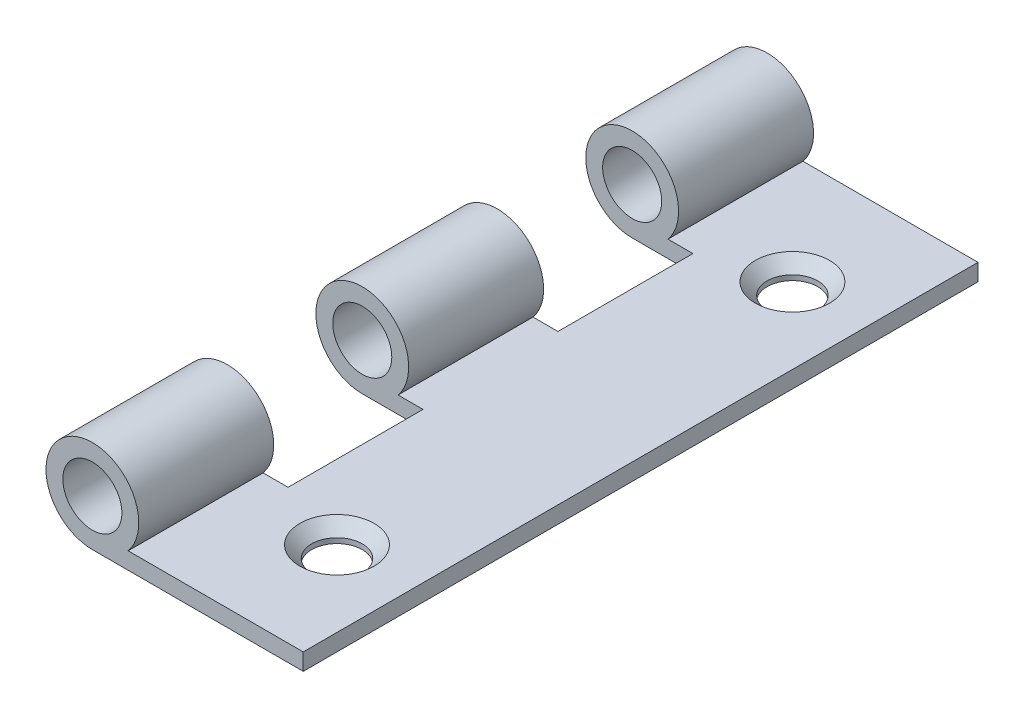
ISO-10303-21;
HEADER;
FILE_DESCRIPTION(('STEP AP214'),'2;1');
FILE_NAME('part.step','',(''),(''),'','','');
FILE_SCHEMA(('AUTOMOTIVE_DESIGN { 1 0 10303 214 1 1 1 1 }'));
ENDSEC;
DATA;
#1=APPLICATION_CONTEXT('core data for automotive mechanical design processes');
#2=APPLICATION_PROTOCOL_DEFINITION('international standard','automotive_design',2000,#1);
#3=PRODUCT_CONTEXT('',#1,'mechanical');
#4=PRODUCT('Part','Part','',(#3));
#5=PRODUCT_RELATED_PRODUCT_CATEGORY('part','',(#4));
#6=PRODUCT_DEFINITION_FORMATION('','',#4);
#7=PRODUCT_DEFINITION_CONTEXT('part definition',#1,'design');
#8=PRODUCT_DEFINITION('design','',#6,#7);
#9=PRODUCT_DEFINITION_SHAPE('','',#8);
#10=(LENGTH_UNIT() NAMED_UNIT(*) SI_UNIT(.MILLI.,.METRE.));
#11=(NAMED_UNIT(*) PLANE_ANGLE_UNIT() SI_UNIT($,.RADIAN.));
#12=(NAMED_UNIT(*) SI_UNIT($,.STERADIAN.) SOLID_ANGLE_UNIT());
#13=UNCERTAINTY_MEASURE_WITH_UNIT(LENGTH_MEASURE(1.E-05),#10,'distance_accuracy_value','');
#14=(GEOMETRIC_REPRESENTATION_CONTEXT(3) GLOBAL_UNCERTAINTY_ASSIGNED_CONTEXT((#13)) GLOBAL_UNIT_ASSIGNED_CONTEXT((#10,
#11,#12)) REPRESENTATION_CONTEXT('',''));
#15=CARTESIAN_POINT('',(0.,0.,0.));
#16=DIRECTION('',(0.,0.,1.));
#17=DIRECTION('',(1.,0.,0.));
#18=AXIS2_PLACEMENT_3D('',#15,#16,#17);
#19=CARTESIAN_POINT('',(12.5,-1.75,40.));
#20=DIRECTION('',(0.,-1.,0.));
#21=DIRECTION('',(1.,0.,0.));
#22=AXIS2_PLACEMENT_3D('',#19,#20,#21);
#23=PLANE('',#22);
#24=CARTESIAN_POINT('',(8.,-1.75,33.5));
#25=DIRECTION('',(0.,1.,0.));
#26=DIRECTION('',(0.,0.,1.));
#27=AXIS2_PLACEMENT_3D('',#24,#25,#26);
#28=CIRCLE('',#27,2.2);
#29=CARTESIAN_POINT('',(8.,-1.75,35.7));
#30=VERTEX_POINT('',#29);
#31=EDGE_CURVE('E306',#30,#30,#28,.T.);
#32=ORIENTED_EDGE('',*,*,#31,.F.);
#33=EDGE_LOOP('',(#32));
#34=FACE_BOUND('',#33,.T.);
#35=CARTESIAN_POINT('',(8.,-1.75,6.5));
#36=DIRECTION('',(0.,1.,0.));
#37=DIRECTION('',(0.,0.,1.));
#38=AXIS2_PLACEMENT_3D('',#35,#36,#37);
#39=CIRCLE('',#38,2.2);
#40=CARTESIAN_POINT('',(8.,-1.75,8.7));
#41=VERTEX_POINT('',#40);
#42=EDGE_CURVE('E232',#41,#41,#39,.T.);
#43=ORIENTED_EDGE('',*,*,#42,.F.);
#44=EDGE_LOOP('',(#43));
#45=FACE_BOUND('',#44,.T.);
#46=DIRECTION('',(1.,0.,0.));
#47=VECTOR('',#46,1.);
#48=CARTESIAN_POINT('',(12.5,-1.75,32.));
#49=LINE('',#48,#47);
#50=CARTESIAN_POINT('',(2.12132034355964,-1.75,32.));
#51=VERTEX_POINT('',#50);
#52=CARTESIAN_POINT('',(3.6,-1.75,32.));
#53=VERTEX_POINT('',#52);
#54=EDGE_CURVE('E135',#51,#53,#49,.T.);
#55=ORIENTED_EDGE('',*,*,#54,.F.);
#56=DIRECTION('',(0.,0.,-1.));
#57=VECTOR('',#56,1.);
#58=CARTESIAN_POINT('',(2.12132034355964,-1.75,40.));
#59=LINE('',#58,#57);
#60=CARTESIAN_POINT('',(2.12132034355964,-1.75,40.));
#61=VERTEX_POINT('',#60);
#62=EDGE_CURVE('E214',#61,#51,#59,.T.);
#63=ORIENTED_EDGE('',*,*,#62,.F.);
#64=DIRECTION('',(-1.,0.,0.));
#65=VECTOR('',#64,1.);
#66=CARTESIAN_POINT('',(12.5,-1.75,40.));
#67=LINE('',#66,#65);
#68=CARTESIAN_POINT('',(12.5,-1.75,40.));
#69=VERTEX_POINT('',#68);
#70=EDGE_CURVE('E189',#69,#61,#67,.T.);
#71=ORIENTED_EDGE('',*,*,#70,.F.);
#72=DIRECTION('',(0.,0.,-1.));
#73=VECTOR('',#72,1.);
#74=CARTESIAN_POINT('',(12.5,-1.75,40.));
#75=LINE('',#74,#73);
#76=CARTESIAN_POINT('',(12.5,-1.75,0.));
#77=VERTEX_POINT('',#76);
#78=EDGE_CURVE('E217',#69,#77,#75,.T.);
#79=ORIENTED_EDGE('',*,*,#78,.T.);
#80=DIRECTION('',(-1.,0.,0.));
#81=VECTOR('',#80,1.);
#82=CARTESIAN_POINT('',(12.5,-1.75,0.));
#83=LINE('',#82,#81);
#84=CARTESIAN_POINT('',(2.12132034355964,-1.75,0.));
#85=VERTEX_POINT('',#84);
#86=EDGE_CURVE('E199',#77,#85,#83,.T.);
#87=ORIENTED_EDGE('',*,*,#86,.T.);
#88=CARTESIAN_POINT('',(2.12132034355964,-1.75,8.));
#89=VERTEX_POINT('',#88);
#90=EDGE_CURVE('E212',#89,#85,#59,.T.);
#91=ORIENTED_EDGE('',*,*,#90,.F.);
#92=DIRECTION('',(-1.,0.,0.));
#93=VECTOR('',#92,1.);
#94=CARTESIAN_POINT('',(12.5,-1.75,8.));
#95=LINE('',#94,#93);
#96=CARTESIAN_POINT('',(3.6,-1.75,8.));
#97=VERTEX_POINT('',#96);
#98=EDGE_CURVE('E166',#97,#89,#95,.T.);
#99=ORIENTED_EDGE('',*,*,#98,.F.);
#100=DIRECTION('',(0.,0.,-1.));
#101=VECTOR('',#100,1.);
#102=CARTESIAN_POINT('',(3.6,-1.75,40.));
#103=LINE('',#102,#101);
#104=CARTESIAN_POINT('',(3.6,-1.75,16.));
#105=VERTEX_POINT('',#104);
#106=EDGE_CURVE('E177',#105,#97,#103,.T.);
#107=ORIENTED_EDGE('',*,*,#106,.F.);
#108=DIRECTION('',(1.,0.,0.));
#109=VECTOR('',#108,1.);
#110=CARTESIAN_POINT('',(12.5,-1.75,16.));
#111=LINE('',#110,#109);
#112=CARTESIAN_POINT('',(2.12132034355964,-1.75,16.));
#113=VERTEX_POINT('',#112);
#114=EDGE_CURVE('E175',#113,#105,#111,.T.);
#115=ORIENTED_EDGE('',*,*,#114,.F.);
#116=CARTESIAN_POINT('',(2.12132034355964,-1.75,24.));
#117=VERTEX_POINT('',#116);
#118=EDGE_CURVE('E144',#117,#113,#59,.T.);
#119=ORIENTED_EDGE('',*,*,#118,.F.);
#120=DIRECTION('',(-1.,0.,0.));
#121=VECTOR('',#120,1.);
#122=CARTESIAN_POINT('',(12.5,-1.75,24.));
#123=LINE('',#122,#121);
#124=CARTESIAN_POINT('',(3.6,-1.75,24.));
#125=VERTEX_POINT('',#124);
#126=EDGE_CURVE('E138',#125,#117,#123,.T.);
#127=ORIENTED_EDGE('',*,*,#126,.F.);
#128=DIRECTION('',(0.,0.,-1.));
#129=VECTOR('',#128,1.);
#130=CARTESIAN_POINT('',(3.6,-1.75,40.));
#131=LINE('',#130,#129);
#132=EDGE_CURVE('E124',#53,#125,#131,.T.);
#133=ORIENTED_EDGE('',*,*,#132,.F.);
#134=EDGE_LOOP('',(#55,#63,#71,#79,#87,#91,#99,#107,#115,#119,#127,#133));
#135=FACE_BOUND('',#134,.T.);
#136=ADVANCED_FACE('F33',(#34,#45,#135),#23,.F.);
#137=CARTESIAN_POINT('',(0.,0.,40.));
#138=DIRECTION('',(0.,0.,-1.));
#139=DIRECTION('',(-1.,0.,0.));
#140=AXIS2_PLACEMENT_3D('',#137,#138,#139);
#141=CYLINDRICAL_SURFACE('',#140,2.75);
#142=CARTESIAN_POINT('',(0.,0.,32.));
#143=DIRECTION('',(0.,0.,-1.));
#144=DIRECTION('',(-1.,0.,0.));
#145=AXIS2_PLACEMENT_3D('',#142,#143,#144);
#146=CIRCLE('',#145,2.75);
#147=CARTESIAN_POINT('',(0.,-2.75,32.));
#148=VERTEX_POINT('',#147);
#149=EDGE_CURVE('E154',#148,#51,#146,.T.);
#150=ORIENTED_EDGE('',*,*,#149,.F.);
#151=DIRECTION('',(0.,0.,-1.));
#152=VECTOR('',#151,1.);
#153=CARTESIAN_POINT('',(0.,-2.75,40.));
#154=LINE('',#153,#152);
#155=CARTESIAN_POINT('',(0.,-2.75,40.));
#156=VERTEX_POINT('',#155);
#157=EDGE_CURVE('E209',#156,#148,#154,.T.);
#158=ORIENTED_EDGE('',*,*,#157,.F.);
#159=CARTESIAN_POINT('',(0.,0.,40.));
#160=DIRECTION('',(0.,0.,1.));
#161=DIRECTION('',(1.,0.,0.));
#162=AXIS2_PLACEMENT_3D('',#159,#160,#161);
#163=CIRCLE('',#162,2.75);
#164=EDGE_CURVE('E192',#61,#156,#163,.T.);
#165=ORIENTED_EDGE('',*,*,#164,.F.);
#166=ORIENTED_EDGE('',*,*,#62,.T.);
#167=EDGE_LOOP('',(#150,#158,#165,#166));
#168=FACE_BOUND('',#167,.T.);
#169=ADVANCED_FACE('F251',(#168),#141,.T.);
#170=CARTESIAN_POINT('',(0.,0.,24.));
#171=DIRECTION('',(0.,0.,1.));
#172=DIRECTION('',(1.,0.,0.));
#173=AXIS2_PLACEMENT_3D('',#170,#171,#172);
#174=CIRCLE('',#173,2.75);
#175=CARTESIAN_POINT('',(0.,-2.75,24.));
#176=VERTEX_POINT('',#175);
#177=EDGE_CURVE('E50',#117,#176,#174,.T.);
#178=ORIENTED_EDGE('',*,*,#177,.F.);
#179=ORIENTED_EDGE('',*,*,#118,.T.);
#180=CARTESIAN_POINT('',(0.,0.,16.));
#181=DIRECTION('',(0.,0.,-1.));
#182=DIRECTION('',(-1.,0.,0.));
#183=AXIS2_PLACEMENT_3D('',#180,#181,#182);
#184=CIRCLE('',#183,2.75);
#185=CARTESIAN_POINT('',(0.,-2.75,16.));
#186=VERTEX_POINT('',#185);
#187=EDGE_CURVE('E172',#186,#113,#184,.T.);
#188=ORIENTED_EDGE('',*,*,#187,.F.);
#189=EDGE_CURVE('E213',#176,#186,#154,.T.);
#190=ORIENTED_EDGE('',*,*,#189,.F.);
#191=EDGE_LOOP('',(#178,#179,#188,#190));
#192=FACE_BOUND('',#191,.T.);
#193=ADVANCED_FACE('F271',(#192),#141,.T.);
#194=CARTESIAN_POINT('',(12.5,-2.75,40.));
#195=DIRECTION('',(0.,1.,0.));
#196=DIRECTION('',(-1.,0.,0.));
#197=AXIS2_PLACEMENT_3D('',#194,#195,#196);
#198=PLANE('',#197);
#199=CARTESIAN_POINT('',(8.,-2.75,33.5));
#200=DIRECTION('',(0.,1.,0.));
#201=DIRECTION('',(-1.,0.,0.));
#202=AXIS2_PLACEMENT_3D('',#199,#200,#201);
#203=CIRCLE('',#202,1.49999999999999);
#204=CARTESIAN_POINT('',(6.50000000000001,-2.75,33.5));
#205=VERTEX_POINT('',#204);
#206=EDGE_CURVE('E37',#205,#205,#203,.T.);
#207=ORIENTED_EDGE('',*,*,#206,.T.);
#208=EDGE_LOOP('',(#207));
#209=FACE_BOUND('',#208,.T.);
#210=CARTESIAN_POINT('',(8.,-2.75,6.5));
#211=DIRECTION('',(0.,1.,0.));
#212=DIRECTION('',(-1.,0.,0.));
#213=AXIS2_PLACEMENT_3D('',#210,#211,#212);
#214=CIRCLE('',#213,1.49999999999999);
#215=CARTESIAN_POINT('',(6.50000000000001,-2.75,6.5));
#216=VERTEX_POINT('',#215);
#217=EDGE_CURVE('E140',#216,#216,#214,.T.);
#218=ORIENTED_EDGE('',*,*,#217,.T.);
#219=EDGE_LOOP('',(#218));
#220=FACE_BOUND('',#219,.T.);
#221=DIRECTION('',(-1.,0.,0.));
#222=VECTOR('',#221,1.);
#223=CARTESIAN_POINT('',(12.5,-2.75,32.));
#224=LINE('',#223,#222);
#225=CARTESIAN_POINT('',(3.6,-2.75,32.));
#226=VERTEX_POINT('',#225);
#227=EDGE_CURVE('E148',#226,#148,#224,.T.);
#228=ORIENTED_EDGE('',*,*,#227,.F.);
#229=DIRECTION('',(0.,0.,1.));
#230=VECTOR('',#229,1.);
#231=CARTESIAN_POINT('',(3.6,-2.75,40.));
#232=LINE('',#231,#230);
#233=CARTESIAN_POINT('',(3.6,-2.75,24.));
#234=VERTEX_POINT('',#233);
#235=EDGE_CURVE('E11',#234,#226,#232,.T.);
#236=ORIENTED_EDGE('',*,*,#235,.F.);
#237=DIRECTION('',(1.,0.,0.));
#238=VECTOR('',#237,1.);
#239=CARTESIAN_POINT('',(12.5,-2.75,24.));
#240=LINE('',#239,#238);
#241=EDGE_CURVE('E139',#176,#234,#240,.T.);
#242=ORIENTED_EDGE('',*,*,#241,.F.);
#243=ORIENTED_EDGE('',*,*,#189,.T.);
#244=DIRECTION('',(-1.,0.,0.));
#245=VECTOR('',#244,1.);
#246=CARTESIAN_POINT('',(12.5,-2.75,16.));
#247=LINE('',#246,#245);
#248=CARTESIAN_POINT('',(3.6,-2.75,16.));
#249=VERTEX_POINT('',#248);
#250=EDGE_CURVE('E169',#249,#186,#247,.T.);
#251=ORIENTED_EDGE('',*,*,#250,.F.);
#252=DIRECTION('',(0.,0.,1.));
#253=VECTOR('',#252,1.);
#254=CARTESIAN_POINT('',(3.6,-2.75,40.));
#255=LINE('',#254,#253);
#256=CARTESIAN_POINT('',(3.6,-2.75,8.));
#257=VERTEX_POINT('',#256);
#258=EDGE_CURVE('E42',#257,#249,#255,.T.);
#259=ORIENTED_EDGE('',*,*,#258,.F.);
#260=DIRECTION('',(1.,0.,0.));
#261=VECTOR('',#260,1.);
#262=CARTESIAN_POINT('',(12.5,-2.75,8.));
#263=LINE('',#262,#261);
#264=CARTESIAN_POINT('',(0.,-2.75,8.));
#265=VERTEX_POINT('',#264);
#266=EDGE_CURVE('E163',#265,#257,#263,.T.);
#267=ORIENTED_EDGE('',*,*,#266,.F.);
#268=CARTESIAN_POINT('',(0.,-2.75,0.));
#269=VERTEX_POINT('',#268);
#270=EDGE_CURVE('E208',#265,#269,#154,.T.);
#271=ORIENTED_EDGE('',*,*,#270,.T.);
#272=DIRECTION('',(1.,0.,0.));
#273=VECTOR('',#272,1.);
#274=CARTESIAN_POINT('',(12.5,-2.75,0.));
#275=LINE('',#274,#273);
#276=CARTESIAN_POINT('',(12.5,-2.75,0.));
#277=VERTEX_POINT('',#276);
#278=EDGE_CURVE('E190',#269,#277,#275,.T.);
#279=ORIENTED_EDGE('',*,*,#278,.T.);
#280=DIRECTION('',(0.,0.,-1.));
#281=VECTOR('',#280,1.);
#282=CARTESIAN_POINT('',(12.5,-2.75,40.));
#283=LINE('',#282,#281);
#284=CARTESIAN_POINT('',(12.5,-2.75,40.));
#285=VERTEX_POINT('',#284);
#286=EDGE_CURVE('E196',#285,#277,#283,.T.);
#287=ORIENTED_EDGE('',*,*,#286,.F.);
#288=DIRECTION('',(1.,0.,0.));
#289=VECTOR('',#288,1.);
#290=CARTESIAN_POINT('',(12.5,-2.75,40.));
#291=LINE('',#290,#289);
#292=EDGE_CURVE('E194',#156,#285,#291,.T.);
#293=ORIENTED_EDGE('',*,*,#292,.F.);
#294=ORIENTED_EDGE('',*,*,#157,.T.);
#295=EDGE_LOOP('',(#228,#236,#242,#243,#251,#259,#267,#271,#279,#287,#293,#294));
#296=FACE_BOUND('',#295,.T.);
#297=ADVANCED_FACE('F245',(#209,#220,#296),#198,.F.);
#298=CARTESIAN_POINT('',(0.,0.,40.));
#299=DIRECTION('',(0.,0.,-1.));
#300=DIRECTION('',(-1.,0.,0.));
#301=AXIS2_PLACEMENT_3D('',#298,#299,#300);
#302=CYLINDRICAL_SURFACE('',#301,1.75);
#303=CARTESIAN_POINT('',(0.,0.,40.));
#304=DIRECTION('',(0.,0.,1.));
#305=DIRECTION('',(1.,0.,0.));
#306=AXIS2_PLACEMENT_3D('',#303,#304,#305);
#307=CIRCLE('',#306,1.75);
#308=CARTESIAN_POINT('',(1.75,0.,40.));
#309=VERTEX_POINT('',#308);
#310=EDGE_CURVE('E180',#309,#309,#307,.T.);
#311=ORIENTED_EDGE('',*,*,#310,.T.);
#312=EDGE_LOOP('',(#311));
#313=FACE_BOUND('',#312,.T.);
#314=CARTESIAN_POINT('',(0.,0.,32.));
#315=DIRECTION('',(0.,0.,-1.));
#316=DIRECTION('',(-1.,0.,0.));
#317=AXIS2_PLACEMENT_3D('',#314,#315,#316);
#318=CIRCLE('',#317,1.75);
#319=CARTESIAN_POINT('',(-1.75,0.,32.));
#320=VERTEX_POINT('',#319);
#321=EDGE_CURVE('E145',#320,#320,#318,.T.);
#322=ORIENTED_EDGE('',*,*,#321,.T.);
#323=EDGE_LOOP('',(#322));
#324=FACE_BOUND('',#323,.T.);
#325=ADVANCED_FACE('F294',(#313,#324),#302,.F.);
#326=CARTESIAN_POINT('',(0.,0.,16.));
#327=DIRECTION('',(0.,0.,-1.));
#328=DIRECTION('',(-1.,0.,0.));
#329=AXIS2_PLACEMENT_3D('',#326,#327,#328);
#330=CIRCLE('',#329,1.75);
#331=CARTESIAN_POINT('',(-1.75,0.,16.));
#332=VERTEX_POINT('',#331);
#333=EDGE_CURVE('E168',#332,#332,#330,.T.);
#334=ORIENTED_EDGE('',*,*,#333,.T.);
#335=EDGE_LOOP('',(#334));
#336=FACE_BOUND('',#335,.T.);
#337=CARTESIAN_POINT('',(0.,0.,24.));
#338=DIRECTION('',(0.,0.,1.));
#339=DIRECTION('',(1.,0.,0.));
#340=AXIS2_PLACEMENT_3D('',#337,#338,#339);
#341=CIRCLE('',#340,1.75);
#342=CARTESIAN_POINT('',(1.75,0.,24.));
#343=VERTEX_POINT('',#342);
#344=EDGE_CURVE('E225',#343,#343,#341,.T.);
#345=ORIENTED_EDGE('',*,*,#344,.T.);
#346=EDGE_LOOP('',(#345));
#347=FACE_BOUND('',#346,.T.);
#348=ADVANCED_FACE('F286',(#336,#347),#302,.F.);
#349=CARTESIAN_POINT('',(0.,0.,8.));
#350=DIRECTION('',(0.,0.,1.));
#351=DIRECTION('',(1.,0.,0.));
#352=AXIS2_PLACEMENT_3D('',#349,#350,#351);
#353=CIRCLE('',#352,2.75);
#354=EDGE_CURVE('E58',#89,#265,#353,.T.);
#355=ORIENTED_EDGE('',*,*,#354,.F.);
#356=ORIENTED_EDGE('',*,*,#90,.T.);
#357=CARTESIAN_POINT('',(0.,0.,0.));
#358=DIRECTION('',(0.,0.,1.));
#359=DIRECTION('',(1.,0.,0.));
#360=AXIS2_PLACEMENT_3D('',#357,#358,#359);
#361=CIRCLE('',#360,2.75);
#362=EDGE_CURVE('E202',#85,#269,#361,.T.);
#363=ORIENTED_EDGE('',*,*,#362,.T.);
#364=ORIENTED_EDGE('',*,*,#270,.F.);
#365=EDGE_LOOP('',(#355,#356,#363,#364));
#366=FACE_BOUND('',#365,.T.);
#367=ADVANCED_FACE('F283',(#366),#141,.T.);
#368=CARTESIAN_POINT('',(0.,0.,0.));
#369=DIRECTION('',(0.,0.,1.));
#370=DIRECTION('',(1.,0.,0.));
#371=AXIS2_PLACEMENT_3D('',#368,#369,#370);
#372=CIRCLE('',#371,1.75);
#373=CARTESIAN_POINT('',(1.75,0.,0.));
#374=VERTEX_POINT('',#373);
#375=EDGE_CURVE('E179',#374,#374,#372,.T.);
#376=ORIENTED_EDGE('',*,*,#375,.F.);
#377=EDGE_LOOP('',(#376));
#378=FACE_BOUND('',#377,.T.);
#379=CARTESIAN_POINT('',(0.,0.,8.));
#380=DIRECTION('',(0.,0.,1.));
#381=DIRECTION('',(1.,0.,0.));
#382=AXIS2_PLACEMENT_3D('',#379,#380,#381);
#383=CIRCLE('',#382,1.75);
#384=CARTESIAN_POINT('',(1.75,0.,8.));
#385=VERTEX_POINT('',#384);
#386=EDGE_CURVE('E162',#385,#385,#383,.T.);
#387=ORIENTED_EDGE('',*,*,#386,.T.);
#388=EDGE_LOOP('',(#387));
#389=FACE_BOUND('',#388,.T.);
#390=ADVANCED_FACE('F285',(#378,#389),#302,.F.);
#391=CARTESIAN_POINT('',(0.,0.,40.));
#392=DIRECTION('',(0.,0.,1.));
#393=DIRECTION('',(1.,0.,0.));
#394=AXIS2_PLACEMENT_3D('',#391,#392,#393);
#395=PLANE('',#394);
#396=DIRECTION('',(0.,1.,0.));
#397=VECTOR('',#396,1.);
#398=CARTESIAN_POINT('',(12.5,-1.75,40.));
#399=LINE('',#398,#397);
#400=EDGE_CURVE('E186',#285,#69,#399,.T.);
#401=ORIENTED_EDGE('',*,*,#400,.T.);
#402=ORIENTED_EDGE('',*,*,#70,.T.);
#403=ORIENTED_EDGE('',*,*,#164,.T.);
#404=ORIENTED_EDGE('',*,*,#292,.T.);
#405=EDGE_LOOP('',(#401,#402,#403,#404));
#406=FACE_BOUND('',#405,.T.);
#407=ORIENTED_EDGE('',*,*,#310,.F.);
#408=EDGE_LOOP('',(#407));
#409=FACE_BOUND('',#408,.T.);
#410=ADVANCED_FACE('F256',(#406,#409),#395,.T.);
#411=CARTESIAN_POINT('',(0.,0.,0.));
#412=DIRECTION('',(0.,0.,1.));
#413=DIRECTION('',(1.,0.,0.));
#414=AXIS2_PLACEMENT_3D('',#411,#412,#413);
#415=PLANE('',#414);
#416=DIRECTION('',(0.,1.,0.));
#417=VECTOR('',#416,1.);
#418=CARTESIAN_POINT('',(12.5,-1.75,0.));
#419=LINE('',#418,#417);
#420=EDGE_CURVE('E183',#277,#77,#419,.T.);
#421=ORIENTED_EDGE('',*,*,#420,.F.);
#422=ORIENTED_EDGE('',*,*,#278,.F.);
#423=ORIENTED_EDGE('',*,*,#362,.F.);
#424=ORIENTED_EDGE('',*,*,#86,.F.);
#425=EDGE_LOOP('',(#421,#422,#423,#424));
#426=FACE_BOUND('',#425,.T.);
#427=ORIENTED_EDGE('',*,*,#375,.T.);
#428=EDGE_LOOP('',(#427));
#429=FACE_BOUND('',#428,.T.);
#430=ADVANCED_FACE('F262',(#426,#429),#415,.F.);
#431=CARTESIAN_POINT('',(12.5,-1.75,40.));
#432=DIRECTION('',(-1.,0.,0.));
#433=DIRECTION('',(0.,0.,1.));
#434=AXIS2_PLACEMENT_3D('',#431,#432,#433);
#435=PLANE('',#434);
#436=ORIENTED_EDGE('',*,*,#420,.T.);
#437=ORIENTED_EDGE('',*,*,#78,.F.);
#438=ORIENTED_EDGE('',*,*,#400,.F.);
#439=ORIENTED_EDGE('',*,*,#286,.T.);
#440=EDGE_LOOP('',(#436,#437,#438,#439));
#441=FACE_BOUND('',#440,.T.);
#442=ADVANCED_FACE('F35',(#441),#435,.F.);
#443=CARTESIAN_POINT('',(3.59999999999999,18.25,8.));
#444=DIRECTION('',(-1.,0.,0.));
#445=DIRECTION('',(0.,-1.,0.));
#446=AXIS2_PLACEMENT_3D('',#443,#444,#445);
#447=PLANE('',#446);
#448=ORIENTED_EDGE('',*,*,#106,.T.);
#449=DIRECTION('',(0.,-1.,0.));
#450=VECTOR('',#449,1.);
#451=CARTESIAN_POINT('',(3.59999999999999,18.25,8.));
#452=LINE('',#451,#450);
#453=EDGE_CURVE('E134',#97,#257,#452,.T.);
#454=ORIENTED_EDGE('',*,*,#453,.T.);
#455=ORIENTED_EDGE('',*,*,#258,.T.);
#456=DIRECTION('',(0.,-1.,0.));
#457=VECTOR('',#456,1.);
#458=CARTESIAN_POINT('',(3.59999999999999,18.25,16.));
#459=LINE('',#458,#457);
#460=EDGE_CURVE('E159',#105,#249,#459,.T.);
#461=ORIENTED_EDGE('',*,*,#460,.F.);
#462=EDGE_LOOP('',(#448,#454,#455,#461));
#463=FACE_BOUND('',#462,.T.);
#464=ADVANCED_FACE('F279',(#463),#447,.T.);
#465=CARTESIAN_POINT('',(-14.2,18.25,16.));
#466=DIRECTION('',(0.,0.,-1.));
#467=DIRECTION('',(-1.,0.,0.));
#468=AXIS2_PLACEMENT_3D('',#465,#466,#467);
#469=PLANE('',#468);
#470=ORIENTED_EDGE('',*,*,#333,.F.);
#471=EDGE_LOOP('',(#470));
#472=FACE_BOUND('',#471,.T.);
#473=ORIENTED_EDGE('',*,*,#114,.T.);
#474=ORIENTED_EDGE('',*,*,#460,.T.);
#475=ORIENTED_EDGE('',*,*,#250,.T.);
#476=ORIENTED_EDGE('',*,*,#187,.T.);
#477=EDGE_LOOP('',(#473,#474,#475,#476));
#478=FACE_BOUND('',#477,.T.);
#479=ADVANCED_FACE('F274',(#472,#478),#469,.T.);
#480=CARTESIAN_POINT('',(-14.2,18.25,8.));
#481=DIRECTION('',(0.,0.,1.));
#482=DIRECTION('',(1.,0.,0.));
#483=AXIS2_PLACEMENT_3D('',#480,#481,#482);
#484=PLANE('',#483);
#485=ORIENTED_EDGE('',*,*,#386,.F.);
#486=EDGE_LOOP('',(#485));
#487=FACE_BOUND('',#486,.T.);
#488=ORIENTED_EDGE('',*,*,#98,.T.);
#489=ORIENTED_EDGE('',*,*,#354,.T.);
#490=ORIENTED_EDGE('',*,*,#266,.T.);
#491=ORIENTED_EDGE('',*,*,#453,.F.);
#492=EDGE_LOOP('',(#488,#489,#490,#491));
#493=FACE_BOUND('',#492,.T.);
#494=ADVANCED_FACE('F281',(#487,#493),#484,.T.);
#495=CARTESIAN_POINT('',(3.6,18.25,24.));
#496=DIRECTION('',(-1.,0.,0.));
#497=DIRECTION('',(0.,-1.,0.));
#498=AXIS2_PLACEMENT_3D('',#495,#496,#497);
#499=PLANE('',#498);
#500=ORIENTED_EDGE('',*,*,#132,.T.);
#501=DIRECTION('',(0.,-1.,0.));
#502=VECTOR('',#501,1.);
#503=CARTESIAN_POINT('',(3.6,18.25,24.));
#504=LINE('',#503,#502);
#505=EDGE_CURVE('E127',#125,#234,#504,.T.);
#506=ORIENTED_EDGE('',*,*,#505,.T.);
#507=ORIENTED_EDGE('',*,*,#235,.T.);
#508=DIRECTION('',(0.,-1.,0.));
#509=VECTOR('',#508,1.);
#510=CARTESIAN_POINT('',(3.6,18.25,32.));
#511=LINE('',#510,#509);
#512=EDGE_CURVE('E130',#53,#226,#511,.T.);
#513=ORIENTED_EDGE('',*,*,#512,.F.);
#514=EDGE_LOOP('',(#500,#506,#507,#513));
#515=FACE_BOUND('',#514,.T.);
#516=ADVANCED_FACE('F126',(#515),#499,.T.);
#517=CARTESIAN_POINT('',(-14.2,18.25,32.));
#518=DIRECTION('',(0.,0.,-1.));
#519=DIRECTION('',(-1.,0.,0.));
#520=AXIS2_PLACEMENT_3D('',#517,#518,#519);
#521=PLANE('',#520);
#522=ORIENTED_EDGE('',*,*,#321,.F.);
#523=EDGE_LOOP('',(#522));
#524=FACE_BOUND('',#523,.T.);
#525=ORIENTED_EDGE('',*,*,#54,.T.);
#526=ORIENTED_EDGE('',*,*,#512,.T.);
#527=ORIENTED_EDGE('',*,*,#227,.T.);
#528=ORIENTED_EDGE('',*,*,#149,.T.);
#529=EDGE_LOOP('',(#525,#526,#527,#528));
#530=FACE_BOUND('',#529,.T.);
#531=ADVANCED_FACE('F242',(#524,#530),#521,.T.);
#532=CARTESIAN_POINT('',(-14.2,18.25,24.));
#533=DIRECTION('',(0.,0.,1.));
#534=DIRECTION('',(1.,0.,0.));
#535=AXIS2_PLACEMENT_3D('',#532,#533,#534);
#536=PLANE('',#535);
#537=ORIENTED_EDGE('',*,*,#344,.F.);
#538=EDGE_LOOP('',(#537));
#539=FACE_BOUND('',#538,.T.);
#540=ORIENTED_EDGE('',*,*,#126,.T.);
#541=ORIENTED_EDGE('',*,*,#177,.T.);
#542=ORIENTED_EDGE('',*,*,#241,.T.);
#543=ORIENTED_EDGE('',*,*,#505,.F.);
#544=EDGE_LOOP('',(#540,#541,#542,#543));
#545=FACE_BOUND('',#544,.T.);
#546=ADVANCED_FACE('F137',(#539,#545),#536,.T.);
#547=CARTESIAN_POINT('',(8.,-1.75,6.5));
#548=DIRECTION('',(0.,1.,0.));
#549=DIRECTION('',(0.,0.,1.));
#550=AXIS2_PLACEMENT_3D('',#547,#548,#549);
#551=CYLINDRICAL_SURFACE('',#550,1.49999999999999);
#552=CARTESIAN_POINT('',(8.,-2.45,6.5));
#553=DIRECTION('',(0.,1.,0.));
#554=DIRECTION('',(0.,0.,1.));
#555=AXIS2_PLACEMENT_3D('',#552,#553,#554);
#556=CIRCLE('',#555,1.5);
#557=CARTESIAN_POINT('',(8.,-2.45,8.));
#558=VERTEX_POINT('',#557);
#559=EDGE_CURVE('E228',#558,#558,#556,.T.);
#560=ORIENTED_EDGE('',*,*,#559,.T.);
#561=EDGE_LOOP('',(#560));
#562=FACE_BOUND('',#561,.T.);
#563=ORIENTED_EDGE('',*,*,#217,.F.);
#564=EDGE_LOOP('',(#563));
#565=FACE_BOUND('',#564,.T.);
#566=ADVANCED_FACE('F312',(#562,#565),#551,.F.);
#567=CARTESIAN_POINT('',(8.,-1.75,6.5));
#568=DIRECTION('',(0.,1.,0.));
#569=DIRECTION('',(0.,0.,1.));
#570=AXIS2_PLACEMENT_3D('',#567,#568,#569);
#571=CONICAL_SURFACE('',#570,2.2,0.785398163397451);
#572=ORIENTED_EDGE('',*,*,#559,.F.);
#573=EDGE_LOOP('',(#572));
#574=FACE_BOUND('',#573,.T.);
#575=ORIENTED_EDGE('',*,*,#42,.T.);
#576=EDGE_LOOP('',(#575));
#577=FACE_BOUND('',#576,.T.);
#578=ADVANCED_FACE('F309',(#574,#577),#571,.F.);
#579=CARTESIAN_POINT('',(8.,-1.75,33.5));
#580=DIRECTION('',(0.,1.,0.));
#581=DIRECTION('',(0.,0.,1.));
#582=AXIS2_PLACEMENT_3D('',#579,#580,#581);
#583=CYLINDRICAL_SURFACE('',#582,1.49999999999999);
#584=CARTESIAN_POINT('',(8.,-2.45,33.5));
#585=DIRECTION('',(0.,1.,0.));
#586=DIRECTION('',(0.,0.,1.));
#587=AXIS2_PLACEMENT_3D('',#584,#585,#586);
#588=CIRCLE('',#587,1.5);
#589=CARTESIAN_POINT('',(8.,-2.45,35.));
#590=VERTEX_POINT('',#589);
#591=EDGE_CURVE('E353',#590,#590,#588,.T.);
#592=ORIENTED_EDGE('',*,*,#591,.T.);
#593=EDGE_LOOP('',(#592));
#594=FACE_BOUND('',#593,.T.);
#595=ORIENTED_EDGE('',*,*,#206,.F.);
#596=EDGE_LOOP('',(#595));
#597=FACE_BOUND('',#596,.T.);
#598=ADVANCED_FACE('F311',(#594,#597),#583,.F.);
#599=CARTESIAN_POINT('',(8.,-1.75,33.5));
#600=DIRECTION('',(0.,1.,0.));
#601=DIRECTION('',(0.,0.,1.));
#602=AXIS2_PLACEMENT_3D('',#599,#600,#601);
#603=CONICAL_SURFACE('',#602,2.2,0.785398163397451);
#604=ORIENTED_EDGE('',*,*,#591,.F.);
#605=EDGE_LOOP('',(#604));
#606=FACE_BOUND('',#605,.T.);
#607=ORIENTED_EDGE('',*,*,#31,.T.);
#608=EDGE_LOOP('',(#607));
#609=FACE_BOUND('',#608,.T.);
#610=ADVANCED_FACE('F319',(#606,#609),#603,.F.);
#611=CLOSED_SHELL('',(#136,#169,#193,#297,#325,#348,#367,#390,#410,#430,#442,#464,#479,#494,
#516,#531,#546,#566,#578,#598,#610));
#612=MANIFOLD_SOLID_BREP('B2',#611);
#613=ADVANCED_BREP_SHAPE_REPRESENTATION('',(#18,#612),#14);
#614=SHAPE_DEFINITION_REPRESENTATION(#9,#613);
ENDSEC;
END-ISO-10303-21;
